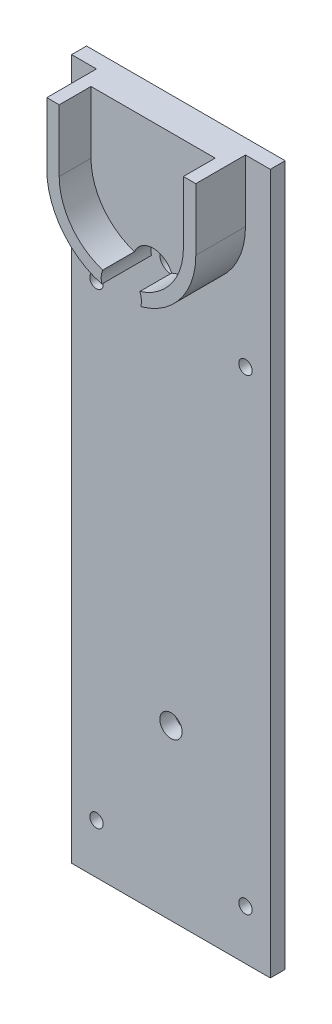
ISO-10303-21;
HEADER;
FILE_DESCRIPTION(('STEP AP214'),'2;1');
FILE_NAME('part.step','',(''),(''),'','','');
FILE_SCHEMA(('AUTOMOTIVE_DESIGN { 1 0 10303 214 1 1 1 1 }'));
ENDSEC;
DATA;
#1=APPLICATION_CONTEXT('core data for automotive mechanical design processes');
#2=APPLICATION_PROTOCOL_DEFINITION('international standard','automotive_design',2000,#1);
#3=PRODUCT_CONTEXT('',#1,'mechanical');
#4=PRODUCT('Part','Part','',(#3));
#5=PRODUCT_RELATED_PRODUCT_CATEGORY('part','',(#4));
#6=PRODUCT_DEFINITION_FORMATION('','',#4);
#7=PRODUCT_DEFINITION_CONTEXT('part definition',#1,'design');
#8=PRODUCT_DEFINITION('design','',#6,#7);
#9=PRODUCT_DEFINITION_SHAPE('','',#8);
#10=(LENGTH_UNIT() NAMED_UNIT(*) SI_UNIT(.MILLI.,.METRE.));
#11=(NAMED_UNIT(*) PLANE_ANGLE_UNIT() SI_UNIT($,.RADIAN.));
#12=(NAMED_UNIT(*) SI_UNIT($,.STERADIAN.) SOLID_ANGLE_UNIT());
#13=UNCERTAINTY_MEASURE_WITH_UNIT(LENGTH_MEASURE(1.E-05),#10,'distance_accuracy_value','');
#14=(GEOMETRIC_REPRESENTATION_CONTEXT(3) GLOBAL_UNCERTAINTY_ASSIGNED_CONTEXT((#13)) GLOBAL_UNIT_ASSIGNED_CONTEXT((#10,
#11,#12)) REPRESENTATION_CONTEXT('',''));
#15=CARTESIAN_POINT('',(0.,0.,0.));
#16=DIRECTION('',(0.,0.,1.));
#17=DIRECTION('',(1.,0.,0.));
#18=AXIS2_PLACEMENT_3D('',#15,#16,#17);
#19=CARTESIAN_POINT('',(0.,0.,3.));
#20=DIRECTION('',(0.,0.,1.));
#21=DIRECTION('',(1.,0.,0.));
#22=AXIS2_PLACEMENT_3D('',#19,#20,#21);
#23=PLANE('',#22);
#24=CARTESIAN_POINT('',(15.,33.5241666666666,3.));
#25=DIRECTION('',(0.,0.,1.));
#26=DIRECTION('',(1.,0.,0.));
#27=AXIS2_PLACEMENT_3D('',#24,#25,#26);
#28=CIRCLE('',#27,1.35);
#29=CARTESIAN_POINT('',(16.35,33.5241666666666,3.));
#30=VERTEX_POINT('',#29);
#31=EDGE_CURVE('E662',#30,#30,#28,.T.);
#32=ORIENTED_EDGE('',*,*,#31,.F.);
#33=EDGE_LOOP('',(#32));
#34=FACE_BOUND('',#33,.T.);
#35=CARTESIAN_POINT('',(15.,-60.5,3.));
#36=DIRECTION('',(0.,0.,1.));
#37=DIRECTION('',(1.,0.,0.));
#38=AXIS2_PLACEMENT_3D('',#35,#36,#37);
#39=CIRCLE('',#38,1.35);
#40=CARTESIAN_POINT('',(16.35,-60.5,3.));
#41=VERTEX_POINT('',#40);
#42=EDGE_CURVE('E654',#41,#41,#39,.T.);
#43=ORIENTED_EDGE('',*,*,#42,.F.);
#44=EDGE_LOOP('',(#43));
#45=FACE_BOUND('',#44,.T.);
#46=CARTESIAN_POINT('',(-15.,33.5241666666666,3.));
#47=DIRECTION('',(0.,0.,1.));
#48=DIRECTION('',(1.,0.,0.));
#49=AXIS2_PLACEMENT_3D('',#46,#47,#48);
#50=CIRCLE('',#49,1.35);
#51=CARTESIAN_POINT('',(-13.65,33.5241666666666,3.));
#52=VERTEX_POINT('',#51);
#53=EDGE_CURVE('E646',#52,#52,#50,.T.);
#54=ORIENTED_EDGE('',*,*,#53,.F.);
#55=EDGE_LOOP('',(#54));
#56=FACE_BOUND('',#55,.T.);
#57=CARTESIAN_POINT('',(-15.,-60.5,3.));
#58=DIRECTION('',(0.,0.,1.));
#59=DIRECTION('',(1.,0.,0.));
#60=AXIS2_PLACEMENT_3D('',#57,#58,#59);
#61=CIRCLE('',#60,1.35);
#62=CARTESIAN_POINT('',(-13.65,-60.5,3.));
#63=VERTEX_POINT('',#62);
#64=EDGE_CURVE('E638',#63,#63,#61,.T.);
#65=ORIENTED_EDGE('',*,*,#64,.F.);
#66=EDGE_LOOP('',(#65));
#67=FACE_BOUND('',#66,.T.);
#68=CARTESIAN_POINT('',(0.,-36.5,3.));
#69=DIRECTION('',(0.,0.,1.));
#70=DIRECTION('',(1.,0.,0.));
#71=AXIS2_PLACEMENT_3D('',#68,#69,#70);
#72=CIRCLE('',#71,2.25);
#73=CARTESIAN_POINT('',(2.25,-36.5,3.));
#74=VERTEX_POINT('',#73);
#75=EDGE_CURVE('E269',#74,#74,#72,.T.);
#76=ORIENTED_EDGE('',*,*,#75,.F.);
#77=EDGE_LOOP('',(#76));
#78=FACE_BOUND('',#77,.T.);
#79=CARTESIAN_POINT('',(0.,44.5,3.));
#80=DIRECTION('',(0.,0.,1.));
#81=DIRECTION('',(1.,0.,0.));
#82=AXIS2_PLACEMENT_3D('',#79,#80,#81);
#83=CIRCLE('',#82,2.25);
#84=CARTESIAN_POINT('',(2.25,44.5,3.));
#85=VERTEX_POINT('',#84);
#86=EDGE_CURVE('E273',#85,#85,#83,.T.);
#87=ORIENTED_EDGE('',*,*,#86,.F.);
#88=EDGE_LOOP('',(#87));
#89=FACE_BOUND('',#88,.T.);
#90=CARTESIAN_POINT('',(0.,58.,3.));
#91=DIRECTION('',(0.,0.,1.));
#92=DIRECTION('',(1.,0.,0.));
#93=AXIS2_PLACEMENT_3D('',#90,#91,#92);
#94=CIRCLE('',#93,15.);
#95=CARTESIAN_POINT('',(3.93068051430735,43.5241666666666,3.));
#96=VERTEX_POINT('',#95);
#97=CARTESIAN_POINT('',(15.,58.,3.));
#98=VERTEX_POINT('',#97);
#99=EDGE_CURVE('E349',#96,#98,#94,.T.);
#100=ORIENTED_EDGE('',*,*,#99,.F.);
#101=CARTESIAN_POINT('',(0.,44.5,3.));
#102=DIRECTION('',(0.,0.,-1.));
#103=DIRECTION('',(1.,0.,0.));
#104=AXIS2_PLACEMENT_3D('',#101,#102,#103);
#105=CIRCLE('',#104,4.05);
#106=CARTESIAN_POINT('',(-3.93068051430735,43.5241666666666,3.));
#107=VERTEX_POINT('',#106);
#108=EDGE_CURVE('E64',#107,#96,#105,.T.);
#109=ORIENTED_EDGE('',*,*,#108,.F.);
#110=CARTESIAN_POINT('',(0.,58.,3.));
#111=DIRECTION('',(0.,0.,1.));
#112=DIRECTION('',(1.,0.,0.));
#113=AXIS2_PLACEMENT_3D('',#110,#111,#112);
#114=CIRCLE('',#113,15.);
#115=CARTESIAN_POINT('',(-15.,58.,3.));
#116=VERTEX_POINT('',#115);
#117=EDGE_CURVE('E201',#116,#107,#114,.T.);
#118=ORIENTED_EDGE('',*,*,#117,.F.);
#119=DIRECTION('',(0.,-1.,0.));
#120=VECTOR('',#119,1.);
#121=CARTESIAN_POINT('',(-15.,58.,3.));
#122=LINE('',#121,#120);
#123=CARTESIAN_POINT('',(-15.,70.5,3.));
#124=VERTEX_POINT('',#123);
#125=EDGE_CURVE('E207',#124,#116,#122,.T.);
#126=ORIENTED_EDGE('',*,*,#125,.F.);
#127=DIRECTION('',(-1.,0.,0.));
#128=VECTOR('',#127,1.);
#129=CARTESIAN_POINT('',(0.,70.5,3.));
#130=LINE('',#129,#128);
#131=CARTESIAN_POINT('',(-20.,70.5,3.));
#132=VERTEX_POINT('',#131);
#133=EDGE_CURVE('E257',#124,#132,#130,.T.);
#134=ORIENTED_EDGE('',*,*,#133,.T.);
#135=DIRECTION('',(0.,-1.,0.));
#136=VECTOR('',#135,1.);
#137=CARTESIAN_POINT('',(-20.,0.,3.));
#138=LINE('',#137,#136);
#139=CARTESIAN_POINT('',(-20.,-70.5,3.));
#140=VERTEX_POINT('',#139);
#141=EDGE_CURVE('E262',#132,#140,#138,.T.);
#142=ORIENTED_EDGE('',*,*,#141,.T.);
#143=DIRECTION('',(-1.,0.,0.));
#144=VECTOR('',#143,1.);
#145=CARTESIAN_POINT('',(0.,-70.5,3.));
#146=LINE('',#145,#144);
#147=CARTESIAN_POINT('',(20.,-70.5,3.));
#148=VERTEX_POINT('',#147);
#149=EDGE_CURVE('E265',#148,#140,#146,.T.);
#150=ORIENTED_EDGE('',*,*,#149,.F.);
#151=DIRECTION('',(0.,-1.,0.));
#152=VECTOR('',#151,1.);
#153=CARTESIAN_POINT('',(20.,0.,3.));
#154=LINE('',#153,#152);
#155=CARTESIAN_POINT('',(20.,70.5,3.));
#156=VERTEX_POINT('',#155);
#157=EDGE_CURVE('E253',#156,#148,#154,.T.);
#158=ORIENTED_EDGE('',*,*,#157,.F.);
#159=CARTESIAN_POINT('',(15.,70.5,3.));
#160=VERTEX_POINT('',#159);
#161=EDGE_CURVE('E259',#156,#160,#130,.T.);
#162=ORIENTED_EDGE('',*,*,#161,.T.);
#163=DIRECTION('',(0.,1.,0.));
#164=VECTOR('',#163,1.);
#165=CARTESIAN_POINT('',(15.,58.,3.));
#166=LINE('',#165,#164);
#167=EDGE_CURVE('E56',#98,#160,#166,.T.);
#168=ORIENTED_EDGE('',*,*,#167,.F.);
#169=EDGE_LOOP('',(#100,#109,#118,#126,#134,#142,#150,#158,#162,#168));
#170=FACE_BOUND('',#169,.T.);
#171=ADVANCED_FACE('F40',(#34,#45,#56,#67,#78,#89,#170),#23,.T.);
#172=CARTESIAN_POINT('',(20.,0.,3.));
#173=DIRECTION('',(1.,0.,0.));
#174=DIRECTION('',(0.,0.,-1.));
#175=AXIS2_PLACEMENT_3D('',#172,#173,#174);
#176=PLANE('',#175);
#177=DIRECTION('',(0.,-1.,0.));
#178=VECTOR('',#177,1.);
#179=CARTESIAN_POINT('',(20.,0.,0.));
#180=LINE('',#179,#178);
#181=CARTESIAN_POINT('',(20.,70.5,0.));
#182=VERTEX_POINT('',#181);
#183=CARTESIAN_POINT('',(20.,-70.5,0.));
#184=VERTEX_POINT('',#183);
#185=EDGE_CURVE('E252',#182,#184,#180,.T.);
#186=ORIENTED_EDGE('',*,*,#185,.F.);
#187=DIRECTION('',(0.,0.,-1.));
#188=VECTOR('',#187,1.);
#189=CARTESIAN_POINT('',(20.,70.5,3.));
#190=LINE('',#189,#188);
#191=EDGE_CURVE('E11',#156,#182,#190,.T.);
#192=ORIENTED_EDGE('',*,*,#191,.F.);
#193=ORIENTED_EDGE('',*,*,#157,.T.);
#194=DIRECTION('',(0.,0.,-1.));
#195=VECTOR('',#194,1.);
#196=CARTESIAN_POINT('',(20.,-70.5,3.));
#197=LINE('',#196,#195);
#198=EDGE_CURVE('E277',#148,#184,#197,.T.);
#199=ORIENTED_EDGE('',*,*,#198,.T.);
#200=EDGE_LOOP('',(#186,#192,#193,#199));
#201=FACE_BOUND('',#200,.T.);
#202=ADVANCED_FACE('F42',(#201),#176,.T.);
#203=CARTESIAN_POINT('',(0.,70.5,3.));
#204=DIRECTION('',(0.,-1.,0.));
#205=DIRECTION('',(0.,0.,-1.));
#206=AXIS2_PLACEMENT_3D('',#203,#204,#205);
#207=PLANE('',#206);
#208=DIRECTION('',(-1.,0.,0.));
#209=VECTOR('',#208,1.);
#210=CARTESIAN_POINT('',(0.,70.5,0.));
#211=LINE('',#210,#209);
#212=CARTESIAN_POINT('',(-20.,70.5,0.));
#213=VERTEX_POINT('',#212);
#214=EDGE_CURVE('E281',#182,#213,#211,.T.);
#215=ORIENTED_EDGE('',*,*,#214,.T.);
#216=DIRECTION('',(0.,0.,-1.));
#217=VECTOR('',#216,1.);
#218=CARTESIAN_POINT('',(-20.,70.5,3.));
#219=LINE('',#218,#217);
#220=EDGE_CURVE('E49',#132,#213,#219,.T.);
#221=ORIENTED_EDGE('',*,*,#220,.F.);
#222=ORIENTED_EDGE('',*,*,#133,.F.);
#223=DIRECTION('',(0.,0.,-1.));
#224=VECTOR('',#223,1.);
#225=CARTESIAN_POINT('',(-15.,70.5,13.));
#226=LINE('',#225,#224);
#227=CARTESIAN_POINT('',(-15.,70.5,13.));
#228=VERTEX_POINT('',#227);
#229=EDGE_CURVE('E234',#228,#124,#226,.T.);
#230=ORIENTED_EDGE('',*,*,#229,.F.);
#231=DIRECTION('',(-1.,0.,0.));
#232=VECTOR('',#231,1.);
#233=CARTESIAN_POINT('',(-12.5,70.5,13.));
#234=LINE('',#233,#232);
#235=CARTESIAN_POINT('',(-12.5,70.5,13.));
#236=VERTEX_POINT('',#235);
#237=EDGE_CURVE('E216',#236,#228,#234,.T.);
#238=ORIENTED_EDGE('',*,*,#237,.F.);
#239=DIRECTION('',(0.,0.,-1.));
#240=VECTOR('',#239,1.);
#241=CARTESIAN_POINT('',(-12.5,70.5,13.));
#242=LINE('',#241,#240);
#243=CARTESIAN_POINT('',(-12.5,70.5,6.6));
#244=VERTEX_POINT('',#243);
#245=EDGE_CURVE('E238',#236,#244,#242,.T.);
#246=ORIENTED_EDGE('',*,*,#245,.T.);
#247=DIRECTION('',(-1.,0.,0.));
#248=VECTOR('',#247,1.);
#249=CARTESIAN_POINT('',(0.,70.5,6.6));
#250=LINE('',#249,#248);
#251=CARTESIAN_POINT('',(12.5,70.5,6.6));
#252=VERTEX_POINT('',#251);
#253=EDGE_CURVE('E339',#252,#244,#250,.T.);
#254=ORIENTED_EDGE('',*,*,#253,.F.);
#255=DIRECTION('',(0.,0.,-1.));
#256=VECTOR('',#255,1.);
#257=CARTESIAN_POINT('',(12.5,70.5,13.));
#258=LINE('',#257,#256);
#259=CARTESIAN_POINT('',(12.5,70.5,13.));
#260=VERTEX_POINT('',#259);
#261=EDGE_CURVE('E185',#260,#252,#258,.T.);
#262=ORIENTED_EDGE('',*,*,#261,.F.);
#263=DIRECTION('',(-1.,0.,0.));
#264=VECTOR('',#263,1.);
#265=CARTESIAN_POINT('',(12.5,70.5,13.));
#266=LINE('',#265,#264);
#267=CARTESIAN_POINT('',(15.,70.5,13.));
#268=VERTEX_POINT('',#267);
#269=EDGE_CURVE('E361',#268,#260,#266,.T.);
#270=ORIENTED_EDGE('',*,*,#269,.F.);
#271=DIRECTION('',(0.,0.,-1.));
#272=VECTOR('',#271,1.);
#273=CARTESIAN_POINT('',(15.,70.5,13.));
#274=LINE('',#273,#272);
#275=EDGE_CURVE('E194',#268,#160,#274,.T.);
#276=ORIENTED_EDGE('',*,*,#275,.T.);
#277=ORIENTED_EDGE('',*,*,#161,.F.);
#278=ORIENTED_EDGE('',*,*,#191,.T.);
#279=EDGE_LOOP('',(#215,#221,#222,#230,#238,#246,#254,#262,#270,#276,#277,#278));
#280=FACE_BOUND('',#279,.T.);
#281=ADVANCED_FACE('F325',(#280),#207,.F.);
#282=CARTESIAN_POINT('',(-20.,0.,3.));
#283=DIRECTION('',(1.,0.,0.));
#284=DIRECTION('',(0.,0.,-1.));
#285=AXIS2_PLACEMENT_3D('',#282,#283,#284);
#286=PLANE('',#285);
#287=DIRECTION('',(0.,-1.,0.));
#288=VECTOR('',#287,1.);
#289=CARTESIAN_POINT('',(-20.,0.,0.));
#290=LINE('',#289,#288);
#291=CARTESIAN_POINT('',(-20.,-70.5,0.));
#292=VERTEX_POINT('',#291);
#293=EDGE_CURVE('E284',#213,#292,#290,.T.);
#294=ORIENTED_EDGE('',*,*,#293,.T.);
#295=DIRECTION('',(0.,0.,-1.));
#296=VECTOR('',#295,1.);
#297=CARTESIAN_POINT('',(-20.,-70.5,3.));
#298=LINE('',#297,#296);
#299=EDGE_CURVE('E301',#140,#292,#298,.T.);
#300=ORIENTED_EDGE('',*,*,#299,.F.);
#301=ORIENTED_EDGE('',*,*,#141,.F.);
#302=ORIENTED_EDGE('',*,*,#220,.T.);
#303=EDGE_LOOP('',(#294,#300,#301,#302));
#304=FACE_BOUND('',#303,.T.);
#305=ADVANCED_FACE('F309',(#304),#286,.F.);
#306=CARTESIAN_POINT('',(0.,-36.5,3.));
#307=DIRECTION('',(0.,0.,-1.));
#308=DIRECTION('',(-1.,0.,0.));
#309=AXIS2_PLACEMENT_3D('',#306,#307,#308);
#310=CYLINDRICAL_SURFACE('',#309,2.25);
#311=ORIENTED_EDGE('',*,*,#75,.T.);
#312=EDGE_LOOP('',(#311));
#313=FACE_BOUND('',#312,.T.);
#314=CARTESIAN_POINT('',(0.,-36.5,0.));
#315=DIRECTION('',(0.,0.,1.));
#316=DIRECTION('',(1.,0.,0.));
#317=AXIS2_PLACEMENT_3D('',#314,#315,#316);
#318=CIRCLE('',#317,2.25);
#319=CARTESIAN_POINT('',(2.25,-36.5,0.));
#320=VERTEX_POINT('',#319);
#321=EDGE_CURVE('E292',#320,#320,#318,.T.);
#322=ORIENTED_EDGE('',*,*,#321,.F.);
#323=EDGE_LOOP('',(#322));
#324=FACE_BOUND('',#323,.T.);
#325=ADVANCED_FACE('F415',(#313,#324),#310,.F.);
#326=CARTESIAN_POINT('',(0.,-70.5,3.));
#327=DIRECTION('',(0.,-1.,0.));
#328=DIRECTION('',(0.,0.,-1.));
#329=AXIS2_PLACEMENT_3D('',#326,#327,#328);
#330=PLANE('',#329);
#331=DIRECTION('',(-1.,0.,0.));
#332=VECTOR('',#331,1.);
#333=CARTESIAN_POINT('',(0.,-70.5,0.));
#334=LINE('',#333,#332);
#335=EDGE_CURVE('E288',#184,#292,#334,.T.);
#336=ORIENTED_EDGE('',*,*,#335,.F.);
#337=ORIENTED_EDGE('',*,*,#198,.F.);
#338=ORIENTED_EDGE('',*,*,#149,.T.);
#339=ORIENTED_EDGE('',*,*,#299,.T.);
#340=EDGE_LOOP('',(#336,#337,#338,#339));
#341=FACE_BOUND('',#340,.T.);
#342=ADVANCED_FACE('F320',(#341),#330,.T.);
#343=CARTESIAN_POINT('',(0.,44.5,3.));
#344=DIRECTION('',(0.,0.,-1.));
#345=DIRECTION('',(-1.,0.,0.));
#346=AXIS2_PLACEMENT_3D('',#343,#344,#345);
#347=CYLINDRICAL_SURFACE('',#346,2.25);
#348=ORIENTED_EDGE('',*,*,#86,.T.);
#349=EDGE_LOOP('',(#348));
#350=FACE_BOUND('',#349,.T.);
#351=CARTESIAN_POINT('',(0.,44.5,0.));
#352=DIRECTION('',(0.,0.,1.));
#353=DIRECTION('',(1.,0.,0.));
#354=AXIS2_PLACEMENT_3D('',#351,#352,#353);
#355=CIRCLE('',#354,2.25);
#356=CARTESIAN_POINT('',(2.25,44.5,0.));
#357=VERTEX_POINT('',#356);
#358=EDGE_CURVE('E258',#357,#357,#355,.T.);
#359=ORIENTED_EDGE('',*,*,#358,.F.);
#360=EDGE_LOOP('',(#359));
#361=FACE_BOUND('',#360,.T.);
#362=ADVANCED_FACE('F398',(#350,#361),#347,.F.);
#363=CARTESIAN_POINT('',(0.,0.,0.));
#364=DIRECTION('',(0.,0.,1.));
#365=DIRECTION('',(1.,0.,0.));
#366=AXIS2_PLACEMENT_3D('',#363,#364,#365);
#367=PLANE('',#366);
#368=CARTESIAN_POINT('',(15.,33.5241666666666,0.));
#369=DIRECTION('',(0.,0.,1.));
#370=DIRECTION('',(1.,0.,0.));
#371=AXIS2_PLACEMENT_3D('',#368,#369,#370);
#372=CIRCLE('',#371,1.35);
#373=CARTESIAN_POINT('',(16.35,33.5241666666666,0.));
#374=VERTEX_POINT('',#373);
#375=EDGE_CURVE('E658',#374,#374,#372,.T.);
#376=ORIENTED_EDGE('',*,*,#375,.T.);
#377=EDGE_LOOP('',(#376));
#378=FACE_BOUND('',#377,.T.);
#379=CARTESIAN_POINT('',(15.,-60.5,0.));
#380=DIRECTION('',(0.,0.,1.));
#381=DIRECTION('',(1.,0.,0.));
#382=AXIS2_PLACEMENT_3D('',#379,#380,#381);
#383=CIRCLE('',#382,1.35);
#384=CARTESIAN_POINT('',(16.35,-60.5,0.));
#385=VERTEX_POINT('',#384);
#386=EDGE_CURVE('E650',#385,#385,#383,.T.);
#387=ORIENTED_EDGE('',*,*,#386,.T.);
#388=EDGE_LOOP('',(#387));
#389=FACE_BOUND('',#388,.T.);
#390=CARTESIAN_POINT('',(-15.,33.5241666666666,0.));
#391=DIRECTION('',(0.,0.,1.));
#392=DIRECTION('',(1.,0.,0.));
#393=AXIS2_PLACEMENT_3D('',#390,#391,#392);
#394=CIRCLE('',#393,1.35);
#395=CARTESIAN_POINT('',(-13.65,33.5241666666666,0.));
#396=VERTEX_POINT('',#395);
#397=EDGE_CURVE('E642',#396,#396,#394,.T.);
#398=ORIENTED_EDGE('',*,*,#397,.T.);
#399=EDGE_LOOP('',(#398));
#400=FACE_BOUND('',#399,.T.);
#401=CARTESIAN_POINT('',(-15.,-60.5,0.));
#402=DIRECTION('',(0.,0.,1.));
#403=DIRECTION('',(1.,0.,0.));
#404=AXIS2_PLACEMENT_3D('',#401,#402,#403);
#405=CIRCLE('',#404,1.35);
#406=CARTESIAN_POINT('',(-13.65,-60.5,0.));
#407=VERTEX_POINT('',#406);
#408=EDGE_CURVE('E164',#407,#407,#405,.T.);
#409=ORIENTED_EDGE('',*,*,#408,.T.);
#410=EDGE_LOOP('',(#409));
#411=FACE_BOUND('',#410,.T.);
#412=ORIENTED_EDGE('',*,*,#185,.T.);
#413=ORIENTED_EDGE('',*,*,#335,.T.);
#414=ORIENTED_EDGE('',*,*,#293,.F.);
#415=ORIENTED_EDGE('',*,*,#214,.F.);
#416=EDGE_LOOP('',(#412,#413,#414,#415));
#417=FACE_BOUND('',#416,.T.);
#418=ORIENTED_EDGE('',*,*,#321,.T.);
#419=EDGE_LOOP('',(#418));
#420=FACE_BOUND('',#419,.T.);
#421=ORIENTED_EDGE('',*,*,#358,.T.);
#422=EDGE_LOOP('',(#421));
#423=FACE_BOUND('',#422,.T.);
#424=ADVANCED_FACE('F315',(#378,#389,#400,#411,#417,#420,#423),#367,.F.);
#425=CARTESIAN_POINT('',(0.,58.,13.));
#426=DIRECTION('',(0.,0.,-1.));
#427=DIRECTION('',(-1.,0.,0.));
#428=AXIS2_PLACEMENT_3D('',#425,#426,#427);
#429=CYLINDRICAL_SURFACE('',#428,15.);
#430=ORIENTED_EDGE('',*,*,#117,.T.);
#431=DIRECTION('',(0.,0.,-1.));
#432=VECTOR('',#431,1.);
#433=CARTESIAN_POINT('',(-3.93068051430735,43.5241666666666,13.));
#434=LINE('',#433,#432);
#435=CARTESIAN_POINT('',(-3.93068051430735,43.5241666666666,13.));
#436=VERTEX_POINT('',#435);
#437=EDGE_CURVE('E249',#436,#107,#434,.T.);
#438=ORIENTED_EDGE('',*,*,#437,.F.);
#439=CARTESIAN_POINT('',(0.,58.,13.));
#440=DIRECTION('',(0.,0.,1.));
#441=DIRECTION('',(1.,0.,0.));
#442=AXIS2_PLACEMENT_3D('',#439,#440,#441);
#443=CIRCLE('',#442,15.);
#444=CARTESIAN_POINT('',(-15.,58.,13.));
#445=VERTEX_POINT('',#444);
#446=EDGE_CURVE('E202',#445,#436,#443,.T.);
#447=ORIENTED_EDGE('',*,*,#446,.F.);
#448=DIRECTION('',(0.,0.,-1.));
#449=VECTOR('',#448,1.);
#450=CARTESIAN_POINT('',(-15.,58.,13.));
#451=LINE('',#450,#449);
#452=EDGE_CURVE('E222',#445,#116,#451,.T.);
#453=ORIENTED_EDGE('',*,*,#452,.T.);
#454=EDGE_LOOP('',(#430,#438,#447,#453));
#455=FACE_BOUND('',#454,.T.);
#456=ADVANCED_FACE('F388',(#455),#429,.T.);
#457=CARTESIAN_POINT('',(0.,44.5,13.));
#458=DIRECTION('',(0.,0.,-1.));
#459=DIRECTION('',(-1.,0.,0.));
#460=AXIS2_PLACEMENT_3D('',#457,#458,#459);
#461=CYLINDRICAL_SURFACE('',#460,4.05);
#462=ORIENTED_EDGE('',*,*,#108,.T.);
#463=DIRECTION('',(0.,0.,-1.));
#464=VECTOR('',#463,1.);
#465=CARTESIAN_POINT('',(3.93068051430735,43.5241666666666,13.));
#466=LINE('',#465,#464);
#467=CARTESIAN_POINT('',(3.93068051430735,43.5241666666666,13.));
#468=VERTEX_POINT('',#467);
#469=EDGE_CURVE('E181',#468,#96,#466,.T.);
#470=ORIENTED_EDGE('',*,*,#469,.F.);
#471=CARTESIAN_POINT('',(0.,44.5,13.));
#472=DIRECTION('',(0.,0.,-1.));
#473=DIRECTION('',(1.,0.,0.));
#474=AXIS2_PLACEMENT_3D('',#471,#472,#473);
#475=CIRCLE('',#474,4.05);
#476=CARTESIAN_POINT('',(3.73311479624745,46.0704629629629,13.));
#477=VERTEX_POINT('',#476);
#478=EDGE_CURVE('E179',#477,#468,#475,.T.);
#479=ORIENTED_EDGE('',*,*,#478,.F.);
#480=DIRECTION('',(0.,0.,-1.));
#481=VECTOR('',#480,1.);
#482=CARTESIAN_POINT('',(3.73311479624745,46.0704629629629,13.));
#483=LINE('',#482,#481);
#484=CARTESIAN_POINT('',(3.73311479624745,46.0704629629629,6.6));
#485=VERTEX_POINT('',#484);
#486=EDGE_CURVE('E171',#477,#485,#483,.T.);
#487=ORIENTED_EDGE('',*,*,#486,.T.);
#488=CARTESIAN_POINT('',(0.,44.5,6.6));
#489=DIRECTION('',(0.,0.,1.));
#490=DIRECTION('',(1.,0.,0.));
#491=AXIS2_PLACEMENT_3D('',#488,#489,#490);
#492=CIRCLE('',#491,4.05);
#493=CARTESIAN_POINT('',(-3.73311479624746,46.0704629629629,6.6));
#494=VERTEX_POINT('',#493);
#495=EDGE_CURVE('E153',#485,#494,#492,.T.);
#496=ORIENTED_EDGE('',*,*,#495,.T.);
#497=DIRECTION('',(0.,0.,-1.));
#498=VECTOR('',#497,1.);
#499=CARTESIAN_POINT('',(-3.73311479624746,46.0704629629629,13.));
#500=LINE('',#499,#498);
#501=CARTESIAN_POINT('',(-3.73311479624746,46.0704629629629,13.));
#502=VERTEX_POINT('',#501);
#503=EDGE_CURVE('E246',#502,#494,#500,.T.);
#504=ORIENTED_EDGE('',*,*,#503,.F.);
#505=CARTESIAN_POINT('',(0.,44.5,13.));
#506=DIRECTION('',(0.,0.,-1.));
#507=DIRECTION('',(1.,0.,0.));
#508=AXIS2_PLACEMENT_3D('',#505,#506,#507);
#509=CIRCLE('',#508,4.05);
#510=EDGE_CURVE('E206',#436,#502,#509,.T.);
#511=ORIENTED_EDGE('',*,*,#510,.F.);
#512=ORIENTED_EDGE('',*,*,#437,.T.);
#513=EDGE_LOOP('',(#462,#470,#479,#487,#496,#504,#511,#512));
#514=FACE_BOUND('',#513,.T.);
#515=ADVANCED_FACE('F178',(#514),#461,.F.);
#516=CARTESIAN_POINT('',(0.,58.,13.));
#517=DIRECTION('',(0.,0.,-1.));
#518=DIRECTION('',(-1.,0.,0.));
#519=AXIS2_PLACEMENT_3D('',#516,#517,#518);
#520=CYLINDRICAL_SURFACE('',#519,12.5);
#521=ORIENTED_EDGE('',*,*,#503,.T.);
#522=CARTESIAN_POINT('',(0.,58.,6.6));
#523=DIRECTION('',(0.,0.,1.));
#524=DIRECTION('',(1.,0.,0.));
#525=AXIS2_PLACEMENT_3D('',#522,#523,#524);
#526=CIRCLE('',#525,12.5);
#527=CARTESIAN_POINT('',(-12.5,58.,6.6));
#528=VERTEX_POINT('',#527);
#529=EDGE_CURVE('E159',#528,#494,#526,.T.);
#530=ORIENTED_EDGE('',*,*,#529,.F.);
#531=DIRECTION('',(0.,0.,-1.));
#532=VECTOR('',#531,1.);
#533=CARTESIAN_POINT('',(-12.5,58.,13.));
#534=LINE('',#533,#532);
#535=CARTESIAN_POINT('',(-12.5,58.,13.));
#536=VERTEX_POINT('',#535);
#537=EDGE_CURVE('E242',#536,#528,#534,.T.);
#538=ORIENTED_EDGE('',*,*,#537,.F.);
#539=CARTESIAN_POINT('',(0.,58.,13.));
#540=DIRECTION('',(0.,0.,-1.));
#541=DIRECTION('',(1.,0.,0.));
#542=AXIS2_PLACEMENT_3D('',#539,#540,#541);
#543=CIRCLE('',#542,12.5);
#544=EDGE_CURVE('E210',#502,#536,#543,.T.);
#545=ORIENTED_EDGE('',*,*,#544,.F.);
#546=EDGE_LOOP('',(#521,#530,#538,#545));
#547=FACE_BOUND('',#546,.T.);
#548=ADVANCED_FACE('F395',(#547),#520,.F.);
#549=CARTESIAN_POINT('',(-12.5,58.,13.));
#550=DIRECTION('',(-1.,0.,0.));
#551=DIRECTION('',(0.,0.,1.));
#552=AXIS2_PLACEMENT_3D('',#549,#550,#551);
#553=PLANE('',#552);
#554=ORIENTED_EDGE('',*,*,#537,.T.);
#555=DIRECTION('',(0.,-1.,0.));
#556=VECTOR('',#555,1.);
#557=CARTESIAN_POINT('',(-12.5,0.,6.6));
#558=LINE('',#557,#556);
#559=EDGE_CURVE('E343',#244,#528,#558,.T.);
#560=ORIENTED_EDGE('',*,*,#559,.F.);
#561=ORIENTED_EDGE('',*,*,#245,.F.);
#562=DIRECTION('',(0.,1.,0.));
#563=VECTOR('',#562,1.);
#564=CARTESIAN_POINT('',(-12.5,58.,13.));
#565=LINE('',#564,#563);
#566=EDGE_CURVE('E213',#536,#236,#565,.T.);
#567=ORIENTED_EDGE('',*,*,#566,.F.);
#568=EDGE_LOOP('',(#554,#560,#561,#567));
#569=FACE_BOUND('',#568,.T.);
#570=ADVANCED_FACE('F342',(#569),#553,.F.);
#571=CARTESIAN_POINT('',(-15.,58.,13.));
#572=DIRECTION('',(1.,0.,0.));
#573=DIRECTION('',(0.,1.,0.));
#574=AXIS2_PLACEMENT_3D('',#571,#572,#573);
#575=PLANE('',#574);
#576=ORIENTED_EDGE('',*,*,#125,.T.);
#577=ORIENTED_EDGE('',*,*,#452,.F.);
#578=DIRECTION('',(0.,-1.,0.));
#579=VECTOR('',#578,1.);
#580=CARTESIAN_POINT('',(-15.,58.,13.));
#581=LINE('',#580,#579);
#582=EDGE_CURVE('E219',#228,#445,#581,.T.);
#583=ORIENTED_EDGE('',*,*,#582,.F.);
#584=ORIENTED_EDGE('',*,*,#229,.T.);
#585=EDGE_LOOP('',(#576,#577,#583,#584));
#586=FACE_BOUND('',#585,.T.);
#587=ADVANCED_FACE('F329',(#586),#575,.F.);
#588=CARTESIAN_POINT('',(0.,58.,13.));
#589=DIRECTION('',(0.,0.,1.));
#590=DIRECTION('',(1.,0.,0.));
#591=AXIS2_PLACEMENT_3D('',#588,#589,#590);
#592=PLANE('',#591);
#593=ORIENTED_EDGE('',*,*,#446,.T.);
#594=ORIENTED_EDGE('',*,*,#510,.T.);
#595=ORIENTED_EDGE('',*,*,#544,.T.);
#596=ORIENTED_EDGE('',*,*,#566,.T.);
#597=ORIENTED_EDGE('',*,*,#237,.T.);
#598=ORIENTED_EDGE('',*,*,#582,.T.);
#599=EDGE_LOOP('',(#593,#594,#595,#596,#597,#598));
#600=FACE_BOUND('',#599,.T.);
#601=ADVANCED_FACE('F333',(#600),#592,.T.);
#602=CARTESIAN_POINT('',(0.,58.,13.));
#603=DIRECTION('',(0.,0.,-1.));
#604=DIRECTION('',(-1.,0.,0.));
#605=AXIS2_PLACEMENT_3D('',#602,#603,#604);
#606=CYLINDRICAL_SURFACE('',#605,15.);
#607=ORIENTED_EDGE('',*,*,#99,.T.);
#608=DIRECTION('',(0.,0.,-1.));
#609=VECTOR('',#608,1.);
#610=CARTESIAN_POINT('',(15.,58.,13.));
#611=LINE('',#610,#609);
#612=CARTESIAN_POINT('',(15.,58.,13.));
#613=VERTEX_POINT('',#612);
#614=EDGE_CURVE('E198',#613,#98,#611,.T.);
#615=ORIENTED_EDGE('',*,*,#614,.F.);
#616=CARTESIAN_POINT('',(0.,58.,13.));
#617=DIRECTION('',(0.,0.,1.));
#618=DIRECTION('',(1.,0.,0.));
#619=AXIS2_PLACEMENT_3D('',#616,#617,#618);
#620=CIRCLE('',#619,15.);
#621=EDGE_CURVE('E354',#468,#613,#620,.T.);
#622=ORIENTED_EDGE('',*,*,#621,.F.);
#623=ORIENTED_EDGE('',*,*,#469,.T.);
#624=EDGE_LOOP('',(#607,#615,#622,#623));
#625=FACE_BOUND('',#624,.T.);
#626=ADVANCED_FACE('F386',(#625),#606,.T.);
#627=CARTESIAN_POINT('',(15.,58.,13.));
#628=DIRECTION('',(-1.,0.,0.));
#629=DIRECTION('',(0.,0.,1.));
#630=AXIS2_PLACEMENT_3D('',#627,#628,#629);
#631=PLANE('',#630);
#632=ORIENTED_EDGE('',*,*,#167,.T.);
#633=ORIENTED_EDGE('',*,*,#275,.F.);
#634=DIRECTION('',(0.,1.,0.));
#635=VECTOR('',#634,1.);
#636=CARTESIAN_POINT('',(15.,58.,13.));
#637=LINE('',#636,#635);
#638=EDGE_CURVE('E358',#613,#268,#637,.T.);
#639=ORIENTED_EDGE('',*,*,#638,.F.);
#640=ORIENTED_EDGE('',*,*,#614,.T.);
#641=EDGE_LOOP('',(#632,#633,#639,#640));
#642=FACE_BOUND('',#641,.T.);
#643=ADVANCED_FACE('F377',(#642),#631,.F.);
#644=CARTESIAN_POINT('',(12.5,58.,13.));
#645=DIRECTION('',(1.,0.,0.));
#646=DIRECTION('',(0.,0.,-1.));
#647=AXIS2_PLACEMENT_3D('',#644,#645,#646);
#648=PLANE('',#647);
#649=ORIENTED_EDGE('',*,*,#261,.T.);
#650=DIRECTION('',(0.,1.,0.));
#651=VECTOR('',#650,1.);
#652=CARTESIAN_POINT('',(12.5,0.,6.6));
#653=LINE('',#652,#651);
#654=CARTESIAN_POINT('',(12.5,58.,6.6));
#655=VERTEX_POINT('',#654);
#656=EDGE_CURVE('E176',#655,#252,#653,.T.);
#657=ORIENTED_EDGE('',*,*,#656,.F.);
#658=DIRECTION('',(0.,0.,-1.));
#659=VECTOR('',#658,1.);
#660=CARTESIAN_POINT('',(12.5,58.,13.));
#661=LINE('',#660,#659);
#662=CARTESIAN_POINT('',(12.5,58.,13.));
#663=VERTEX_POINT('',#662);
#664=EDGE_CURVE('E174',#663,#655,#661,.T.);
#665=ORIENTED_EDGE('',*,*,#664,.F.);
#666=DIRECTION('',(0.,-1.,0.));
#667=VECTOR('',#666,1.);
#668=CARTESIAN_POINT('',(12.5,58.,13.));
#669=LINE('',#668,#667);
#670=EDGE_CURVE('E364',#260,#663,#669,.T.);
#671=ORIENTED_EDGE('',*,*,#670,.F.);
#672=EDGE_LOOP('',(#649,#657,#665,#671));
#673=FACE_BOUND('',#672,.T.);
#674=ADVANCED_FACE('F492',(#673),#648,.F.);
#675=CARTESIAN_POINT('',(0.,58.,13.));
#676=DIRECTION('',(0.,0.,-1.));
#677=DIRECTION('',(-1.,0.,0.));
#678=AXIS2_PLACEMENT_3D('',#675,#676,#677);
#679=CYLINDRICAL_SURFACE('',#678,12.5);
#680=ORIENTED_EDGE('',*,*,#664,.T.);
#681=CARTESIAN_POINT('',(0.,58.,6.6));
#682=DIRECTION('',(0.,0.,1.));
#683=DIRECTION('',(1.,0.,0.));
#684=AXIS2_PLACEMENT_3D('',#681,#682,#683);
#685=CIRCLE('',#684,12.5);
#686=EDGE_CURVE('E156',#485,#655,#685,.T.);
#687=ORIENTED_EDGE('',*,*,#686,.F.);
#688=ORIENTED_EDGE('',*,*,#486,.F.);
#689=CARTESIAN_POINT('',(0.,58.,13.));
#690=DIRECTION('',(0.,0.,-1.));
#691=DIRECTION('',(1.,0.,0.));
#692=AXIS2_PLACEMENT_3D('',#689,#690,#691);
#693=CIRCLE('',#692,12.5);
#694=EDGE_CURVE('E367',#663,#477,#693,.T.);
#695=ORIENTED_EDGE('',*,*,#694,.F.);
#696=EDGE_LOOP('',(#680,#687,#688,#695));
#697=FACE_BOUND('',#696,.T.);
#698=ADVANCED_FACE('F169',(#697),#679,.F.);
#699=CARTESIAN_POINT('',(0.,58.,13.));
#700=DIRECTION('',(0.,0.,1.));
#701=DIRECTION('',(1.,0.,0.));
#702=AXIS2_PLACEMENT_3D('',#699,#700,#701);
#703=PLANE('',#702);
#704=ORIENTED_EDGE('',*,*,#621,.T.);
#705=ORIENTED_EDGE('',*,*,#638,.T.);
#706=ORIENTED_EDGE('',*,*,#269,.T.);
#707=ORIENTED_EDGE('',*,*,#670,.T.);
#708=ORIENTED_EDGE('',*,*,#694,.T.);
#709=ORIENTED_EDGE('',*,*,#478,.T.);
#710=EDGE_LOOP('',(#704,#705,#706,#707,#708,#709));
#711=FACE_BOUND('',#710,.T.);
#712=ADVANCED_FACE('F383',(#711),#703,.T.);
#713=CARTESIAN_POINT('',(0.,0.,6.6));
#714=DIRECTION('',(0.,0.,1.));
#715=DIRECTION('',(1.,0.,0.));
#716=AXIS2_PLACEMENT_3D('',#713,#714,#715);
#717=PLANE('',#716);
#718=ORIENTED_EDGE('',*,*,#495,.F.);
#719=ORIENTED_EDGE('',*,*,#686,.T.);
#720=ORIENTED_EDGE('',*,*,#656,.T.);
#721=ORIENTED_EDGE('',*,*,#253,.T.);
#722=ORIENTED_EDGE('',*,*,#559,.T.);
#723=ORIENTED_EDGE('',*,*,#529,.T.);
#724=EDGE_LOOP('',(#718,#719,#720,#721,#722,#723));
#725=FACE_BOUND('',#724,.T.);
#726=ADVANCED_FACE('F155',(#725),#717,.T.);
#727=CARTESIAN_POINT('',(-15.,-60.5,3.));
#728=DIRECTION('',(0.,0.,1.));
#729=DIRECTION('',(1.,0.,0.));
#730=AXIS2_PLACEMENT_3D('',#727,#728,#729);
#731=CYLINDRICAL_SURFACE('',#730,1.35);
#732=ORIENTED_EDGE('',*,*,#408,.F.);
#733=EDGE_LOOP('',(#732));
#734=FACE_BOUND('',#733,.T.);
#735=ORIENTED_EDGE('',*,*,#64,.T.);
#736=EDGE_LOOP('',(#735));
#737=FACE_BOUND('',#736,.T.);
#738=ADVANCED_FACE('F481',(#734,#737),#731,.F.);
#739=CARTESIAN_POINT('',(-15.,33.5241666666666,3.));
#740=DIRECTION('',(0.,0.,1.));
#741=DIRECTION('',(1.,0.,0.));
#742=AXIS2_PLACEMENT_3D('',#739,#740,#741);
#743=CYLINDRICAL_SURFACE('',#742,1.35);
#744=ORIENTED_EDGE('',*,*,#397,.F.);
#745=EDGE_LOOP('',(#744));
#746=FACE_BOUND('',#745,.T.);
#747=ORIENTED_EDGE('',*,*,#53,.T.);
#748=EDGE_LOOP('',(#747));
#749=FACE_BOUND('',#748,.T.);
#750=ADVANCED_FACE('F461',(#746,#749),#743,.F.);
#751=CARTESIAN_POINT('',(15.,-60.5,3.));
#752=DIRECTION('',(0.,0.,1.));
#753=DIRECTION('',(1.,0.,0.));
#754=AXIS2_PLACEMENT_3D('',#751,#752,#753);
#755=CYLINDRICAL_SURFACE('',#754,1.35);
#756=ORIENTED_EDGE('',*,*,#386,.F.);
#757=EDGE_LOOP('',(#756));
#758=FACE_BOUND('',#757,.T.);
#759=ORIENTED_EDGE('',*,*,#42,.T.);
#760=EDGE_LOOP('',(#759));
#761=FACE_BOUND('',#760,.T.);
#762=ADVANCED_FACE('F455',(#758,#761),#755,.F.);
#763=CARTESIAN_POINT('',(15.,33.5241666666666,3.));
#764=DIRECTION('',(0.,0.,1.));
#765=DIRECTION('',(1.,0.,0.));
#766=AXIS2_PLACEMENT_3D('',#763,#764,#765);
#767=CYLINDRICAL_SURFACE('',#766,1.35);
#768=ORIENTED_EDGE('',*,*,#375,.F.);
#769=EDGE_LOOP('',(#768));
#770=FACE_BOUND('',#769,.T.);
#771=ORIENTED_EDGE('',*,*,#31,.T.);
#772=EDGE_LOOP('',(#771));
#773=FACE_BOUND('',#772,.T.);
#774=ADVANCED_FACE('F460',(#770,#773),#767,.F.);
#775=CLOSED_SHELL('',(#171,#202,#281,#305,#325,#342,#362,#424,#456,#515,#548,#570,#587,#601,
#626,#643,#674,#698,#712,#726,#738,#750,#762,#774));
#776=MANIFOLD_SOLID_BREP('B2',#775);
#777=ADVANCED_BREP_SHAPE_REPRESENTATION('',(#18,#776),#14);
#778=SHAPE_DEFINITION_REPRESENTATION(#9,#777);
ENDSEC;
END-ISO-10303-21;
